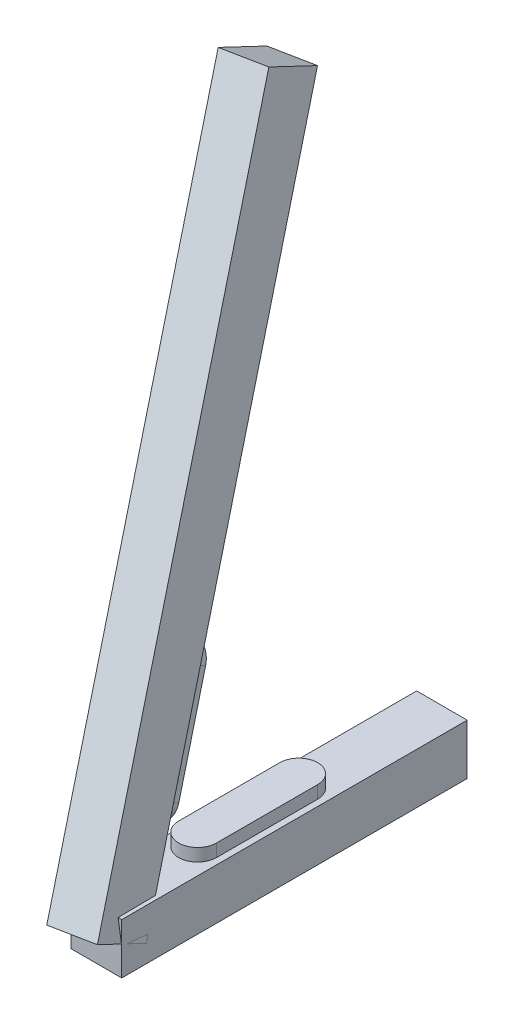
ISO-10303-21;
HEADER;
FILE_DESCRIPTION(('STEP AP214'),'2;1');
FILE_NAME('part.step','',(''),(''),'','','');
FILE_SCHEMA(('AUTOMOTIVE_DESIGN { 1 0 10303 214 1 1 1 1 }'));
ENDSEC;
DATA;
#1=APPLICATION_CONTEXT('core data for automotive mechanical design processes');
#2=APPLICATION_PROTOCOL_DEFINITION('international standard','automotive_design',2000,#1);
#3=PRODUCT_CONTEXT('',#1,'mechanical');
#4=PRODUCT('Part','Part','',(#3));
#5=PRODUCT_RELATED_PRODUCT_CATEGORY('part','',(#4));
#6=PRODUCT_DEFINITION_FORMATION('','',#4);
#7=PRODUCT_DEFINITION_CONTEXT('part definition',#1,'design');
#8=PRODUCT_DEFINITION('design','',#6,#7);
#9=PRODUCT_DEFINITION_SHAPE('','',#8);
#10=(LENGTH_UNIT() NAMED_UNIT(*) SI_UNIT(.MILLI.,.METRE.));
#11=(NAMED_UNIT(*) PLANE_ANGLE_UNIT() SI_UNIT($,.RADIAN.));
#12=(NAMED_UNIT(*) SI_UNIT($,.STERADIAN.) SOLID_ANGLE_UNIT());
#13=UNCERTAINTY_MEASURE_WITH_UNIT(LENGTH_MEASURE(1.E-05),#10,'distance_accuracy_value','');
#14=(GEOMETRIC_REPRESENTATION_CONTEXT(3) GLOBAL_UNCERTAINTY_ASSIGNED_CONTEXT((#13)) GLOBAL_UNIT_ASSIGNED_CONTEXT((#10,
#11,#12)) REPRESENTATION_CONTEXT('',''));
#15=CARTESIAN_POINT('',(0.,0.,0.));
#16=DIRECTION('',(0.,0.,1.));
#17=DIRECTION('',(1.,0.,0.));
#18=AXIS2_PLACEMENT_3D('',#15,#16,#17);
#19=CARTESIAN_POINT('',(0.,19.05,-101.6));
#20=DIRECTION('',(0.,-1.,0.));
#21=DIRECTION('',(0.,0.,-1.));
#22=AXIS2_PLACEMENT_3D('',#19,#20,#21);
#23=CYLINDRICAL_SURFACE('',#22,9.525);
#24=CARTESIAN_POINT('',(0.,12.7,-101.6));
#25=DIRECTION('',(0.,-1.,0.));
#26=DIRECTION('',(0.,0.,-1.));
#27=AXIS2_PLACEMENT_3D('',#24,#25,#26);
#28=CIRCLE('',#27,9.525);
#29=CARTESIAN_POINT('',(-9.52499999999999,12.7,-101.6));
#30=VERTEX_POINT('',#29);
#31=CARTESIAN_POINT('',(9.525,12.7,-101.599999999998));
#32=VERTEX_POINT('',#31);
#33=EDGE_CURVE('E120',#30,#32,#28,.T.);
#34=ORIENTED_EDGE('',*,*,#33,.F.);
#35=DIRECTION('',(0.,-1.,0.));
#36=VECTOR('',#35,1.);
#37=CARTESIAN_POINT('',(-9.52499999999999,19.05,-101.6));
#38=LINE('',#37,#36);
#39=CARTESIAN_POINT('',(-9.52499999999999,19.05,-101.6));
#40=VERTEX_POINT('',#39);
#41=EDGE_CURVE('E12',#40,#30,#38,.T.);
#42=ORIENTED_EDGE('',*,*,#41,.F.);
#43=CARTESIAN_POINT('',(0.,19.05,-101.6));
#44=DIRECTION('',(0.,-1.,0.));
#45=DIRECTION('',(0.,0.,-1.));
#46=AXIS2_PLACEMENT_3D('',#43,#44,#45);
#47=CIRCLE('',#46,9.525);
#48=CARTESIAN_POINT('',(9.525,19.05,-101.599999999998));
#49=VERTEX_POINT('',#48);
#50=EDGE_CURVE('E114',#40,#49,#47,.T.);
#51=ORIENTED_EDGE('',*,*,#50,.T.);
#52=DIRECTION('',(0.,-1.,0.));
#53=VECTOR('',#52,1.);
#54=CARTESIAN_POINT('',(9.525,19.05,-101.599999999998));
#55=LINE('',#54,#53);
#56=EDGE_CURVE('E59',#49,#32,#55,.T.);
#57=ORIENTED_EDGE('',*,*,#56,.T.);
#58=EDGE_LOOP('',(#34,#42,#51,#57));
#59=FACE_BOUND('',#58,.T.);
#60=ADVANCED_FACE('F56',(#59),#23,.T.);
#61=CARTESIAN_POINT('',(-9.52499999999999,19.05,-101.6));
#62=DIRECTION('',(-1.,0.,0.));
#63=DIRECTION('',(0.,0.,1.));
#64=AXIS2_PLACEMENT_3D('',#61,#62,#63);
#65=PLANE('',#64);
#66=DIRECTION('',(0.,0.,-1.));
#67=VECTOR('',#66,1.);
#68=CARTESIAN_POINT('',(-9.52499999999999,12.7,-101.6));
#69=LINE('',#68,#67);
#70=CARTESIAN_POINT('',(-9.52499999999999,12.7,-50.8));
#71=VERTEX_POINT('',#70);
#72=EDGE_CURVE('E116',#71,#30,#69,.T.);
#73=ORIENTED_EDGE('',*,*,#72,.F.);
#74=DIRECTION('',(0.,-1.,0.));
#75=VECTOR('',#74,1.);
#76=CARTESIAN_POINT('',(-9.52499999999999,19.05,-50.8));
#77=LINE('',#76,#75);
#78=CARTESIAN_POINT('',(-9.52499999999999,19.05,-50.8));
#79=VERTEX_POINT('',#78);
#80=EDGE_CURVE('E65',#79,#71,#77,.T.);
#81=ORIENTED_EDGE('',*,*,#80,.F.);
#82=DIRECTION('',(0.,0.,-1.));
#83=VECTOR('',#82,1.);
#84=CARTESIAN_POINT('',(-9.52499999999999,19.05,-101.6));
#85=LINE('',#84,#83);
#86=EDGE_CURVE('E111',#79,#40,#85,.T.);
#87=ORIENTED_EDGE('',*,*,#86,.T.);
#88=ORIENTED_EDGE('',*,*,#41,.T.);
#89=EDGE_LOOP('',(#73,#81,#87,#88));
#90=FACE_BOUND('',#89,.T.);
#91=ADVANCED_FACE('F130',(#90),#65,.T.);
#92=CARTESIAN_POINT('',(0.,19.05,-50.8));
#93=DIRECTION('',(0.,-1.,0.));
#94=DIRECTION('',(0.,0.,-1.));
#95=AXIS2_PLACEMENT_3D('',#92,#93,#94);
#96=CYLINDRICAL_SURFACE('',#95,9.525);
#97=CARTESIAN_POINT('',(0.,12.7,-50.8));
#98=DIRECTION('',(0.,-1.,0.));
#99=DIRECTION('',(0.,0.,-1.));
#100=AXIS2_PLACEMENT_3D('',#97,#98,#99);
#101=CIRCLE('',#100,9.525);
#102=CARTESIAN_POINT('',(9.525,12.7,-50.8));
#103=VERTEX_POINT('',#102);
#104=EDGE_CURVE('E106',#103,#71,#101,.T.);
#105=ORIENTED_EDGE('',*,*,#104,.F.);
#106=DIRECTION('',(0.,-1.,0.));
#107=VECTOR('',#106,1.);
#108=CARTESIAN_POINT('',(9.525,19.05,-50.8));
#109=LINE('',#108,#107);
#110=CARTESIAN_POINT('',(9.525,19.05,-50.8));
#111=VERTEX_POINT('',#110);
#112=EDGE_CURVE('E101',#111,#103,#109,.T.);
#113=ORIENTED_EDGE('',*,*,#112,.F.);
#114=CARTESIAN_POINT('',(0.,19.05,-50.8));
#115=DIRECTION('',(0.,-1.,0.));
#116=DIRECTION('',(0.,0.,-1.));
#117=AXIS2_PLACEMENT_3D('',#114,#115,#116);
#118=CIRCLE('',#117,9.525);
#119=EDGE_CURVE('E104',#111,#79,#118,.T.);
#120=ORIENTED_EDGE('',*,*,#119,.T.);
#121=ORIENTED_EDGE('',*,*,#80,.T.);
#122=EDGE_LOOP('',(#105,#113,#120,#121));
#123=FACE_BOUND('',#122,.T.);
#124=ADVANCED_FACE('F103',(#123),#96,.T.);
#125=CARTESIAN_POINT('',(9.525,19.05,-101.599999999998));
#126=DIRECTION('',(1.,0.,0.));
#127=DIRECTION('',(0.,0.,-1.));
#128=AXIS2_PLACEMENT_3D('',#125,#126,#127);
#129=PLANE('',#128);
#130=DIRECTION('',(0.,0.,1.));
#131=VECTOR('',#130,1.);
#132=CARTESIAN_POINT('',(9.525,12.7,-101.599999999998));
#133=LINE('',#132,#131);
#134=EDGE_CURVE('E123',#32,#103,#133,.T.);
#135=ORIENTED_EDGE('',*,*,#134,.F.);
#136=ORIENTED_EDGE('',*,*,#56,.F.);
#137=DIRECTION('',(0.,0.,1.));
#138=VECTOR('',#137,1.);
#139=CARTESIAN_POINT('',(9.525,19.05,-101.599999999998));
#140=LINE('',#139,#138);
#141=EDGE_CURVE('E110',#49,#111,#140,.T.);
#142=ORIENTED_EDGE('',*,*,#141,.T.);
#143=ORIENTED_EDGE('',*,*,#112,.T.);
#144=EDGE_LOOP('',(#135,#136,#142,#143));
#145=FACE_BOUND('',#144,.T.);
#146=ADVANCED_FACE('F113',(#145),#129,.T.);
#147=CARTESIAN_POINT('',(0.,19.05,-101.6));
#148=DIRECTION('',(0.,-1.,0.));
#149=DIRECTION('',(0.,0.,-1.));
#150=AXIS2_PLACEMENT_3D('',#147,#148,#149);
#151=PLANE('',#150);
#152=ORIENTED_EDGE('',*,*,#50,.F.);
#153=ORIENTED_EDGE('',*,*,#86,.F.);
#154=ORIENTED_EDGE('',*,*,#119,.F.);
#155=ORIENTED_EDGE('',*,*,#141,.F.);
#156=EDGE_LOOP('',(#152,#153,#154,#155));
#157=FACE_BOUND('',#156,.T.);
#158=ADVANCED_FACE('F109',(#157),#151,.F.);
#159=CARTESIAN_POINT('',(0.,12.7,-101.6));
#160=DIRECTION('',(0.,-1.,0.));
#161=DIRECTION('',(0.,0.,-1.));
#162=AXIS2_PLACEMENT_3D('',#159,#160,#161);
#163=PLANE('',#162);
#164=ORIENTED_EDGE('',*,*,#33,.T.);
#165=ORIENTED_EDGE('',*,*,#134,.T.);
#166=ORIENTED_EDGE('',*,*,#104,.T.);
#167=ORIENTED_EDGE('',*,*,#72,.T.);
#168=EDGE_LOOP('',(#164,#165,#166,#167));
#169=FACE_BOUND('',#168,.T.);
#170=ADVANCED_FACE('F129',(#169),#163,.T.);
#171=CLOSED_SHELL('',(#60,#91,#124,#146,#158,#170));
#172=MANIFOLD_SOLID_BREP('B2',#171);
#173=CARTESIAN_POINT('',(-13.6920913841286,83.7622771987389,-59.007372861451));
#174=DIRECTION('',(-0.0502228962965226,0.406896080641067,0.912092780503457));
#175=DIRECTION('',(0.,-0.913245264918281,0.407410218458421));
#176=AXIS2_PLACEMENT_3D('',#173,#174,#175);
#177=CYLINDRICAL_SURFACE('',#176,9.525);
#178=CARTESIAN_POINT('',(-14.0110067756115,86.3460673108096,-53.2155837052541));
#179=DIRECTION('',(-0.0502228962965226,0.406896080641067,0.912092780503457));
#180=DIRECTION('',(0.,-0.913245264918281,0.407410218458421));
#181=AXIS2_PLACEMENT_3D('',#178,#179,#180);
#182=CIRCLE('',#181,9.525);
#183=CARTESIAN_POINT('',(-4.59767830144747,87.7946903298167,-53.3435031576292));
#184=VERTEX_POINT('',#183);
#185=CARTESIAN_POINT('',(-23.4243352497755,84.8974442918027,-53.0876642528789));
#186=VERTEX_POINT('',#185);
#187=EDGE_CURVE('E254',#184,#186,#182,.T.);
#188=ORIENTED_EDGE('',*,*,#187,.F.);
#189=DIRECTION('',(-0.0502228962965226,0.406896080641067,0.912092780503457));
#190=VECTOR('',#189,1.);
#191=CARTESIAN_POINT('',(-4.27876290996455,85.2109002177459,-59.1352923138262));
#192=LINE('',#191,#190);
#193=CARTESIAN_POINT('',(-4.27876290996455,85.2109002177459,-59.1352923138262));
#194=VERTEX_POINT('',#193);
#195=EDGE_CURVE('E54',#194,#184,#192,.T.);
#196=ORIENTED_EDGE('',*,*,#195,.F.);
#197=CARTESIAN_POINT('',(-13.6920913841286,83.7622771987389,-59.007372861451));
#198=DIRECTION('',(-0.0502228962965226,0.406896080641067,0.912092780503457));
#199=DIRECTION('',(0.,-0.913245264918281,0.407410218458421));
#200=AXIS2_PLACEMENT_3D('',#197,#198,#199);
#201=CIRCLE('',#200,9.525);
#202=CARTESIAN_POINT('',(-23.1054198582926,82.3136541797319,-58.8794534090759));
#203=VERTEX_POINT('',#202);
#204=EDGE_CURVE('E248',#194,#203,#201,.T.);
#205=ORIENTED_EDGE('',*,*,#204,.T.);
#206=DIRECTION('',(-0.0502228962965226,0.406896080641067,0.912092780503457));
#207=VECTOR('',#206,1.);
#208=CARTESIAN_POINT('',(-23.1054198582926,82.3136541797319,-58.8794534090759));
#209=LINE('',#208,#207);
#210=EDGE_CURVE('E193',#203,#186,#209,.T.);
#211=ORIENTED_EDGE('',*,*,#210,.T.);
#212=EDGE_LOOP('',(#188,#196,#205,#211));
#213=FACE_BOUND('',#212,.T.);
#214=ADVANCED_FACE('F190',(#213),#177,.T.);
#215=CARTESIAN_POINT('',(-4.27876290996455,85.2109002177459,-59.1352923138262));
#216=DIRECTION('',(0.98827595529281,0.152086406194962,-0.0134298637664212));
#217=DIRECTION('',(-0.152100123296979,0.988365090689186,0.));
#218=AXIS2_PLACEMENT_3D('',#215,#216,#217);
#219=PLANE('',#218);
#220=DIRECTION('',(-0.144181472033241,0.900724877312511,-0.409763832606891));
#221=VECTOR('',#220,1.);
#222=CARTESIAN_POINT('',(-4.59767830144747,87.7946903298167,-53.3435031576292));
#223=LINE('',#222,#221);
#224=CARTESIAN_POINT('',(2.7267404778412,42.0378665623411,-32.5275004611991));
#225=VERTEX_POINT('',#224);
#226=EDGE_CURVE('E250',#225,#184,#223,.T.);
#227=ORIENTED_EDGE('',*,*,#226,.F.);
#228=DIRECTION('',(-0.0502228962965226,0.406896080641067,0.912092780503457));
#229=VECTOR('',#228,1.);
#230=CARTESIAN_POINT('',(3.04565586932411,39.4540764502703,-38.3192896173961));
#231=LINE('',#230,#229);
#232=CARTESIAN_POINT('',(3.04565586932411,39.4540764502703,-38.3192896173961));
#233=VERTEX_POINT('',#232);
#234=EDGE_CURVE('E199',#233,#225,#231,.T.);
#235=ORIENTED_EDGE('',*,*,#234,.F.);
#236=DIRECTION('',(-0.144181472033241,0.900724877312511,-0.409763832606891));
#237=VECTOR('',#236,1.);
#238=CARTESIAN_POINT('',(-4.27876290996455,85.2109002177459,-59.1352923138262));
#239=LINE('',#238,#237);
#240=EDGE_CURVE('E245',#233,#194,#239,.T.);
#241=ORIENTED_EDGE('',*,*,#240,.T.);
#242=ORIENTED_EDGE('',*,*,#195,.T.);
#243=EDGE_LOOP('',(#227,#235,#241,#242));
#244=FACE_BOUND('',#243,.T.);
#245=ADVANCED_FACE('F264',(#244),#219,.T.);
#246=CARTESIAN_POINT('',(-6.3676726048399,38.0054534312633,-38.1913701650209));
#247=DIRECTION('',(-0.0502228962965226,0.406896080641067,0.912092780503457));
#248=DIRECTION('',(0.,-0.913245264918281,0.407410218458421));
#249=AXIS2_PLACEMENT_3D('',#246,#247,#248);
#250=CYLINDRICAL_SURFACE('',#249,9.525);
#251=CARTESIAN_POINT('',(-6.68658799632282,40.589243543334,-32.399581008824));
#252=DIRECTION('',(-0.0502228962965226,0.406896080641067,0.912092780503457));
#253=DIRECTION('',(0.,-0.913245264918281,0.407410218458421));
#254=AXIS2_PLACEMENT_3D('',#251,#252,#253);
#255=CIRCLE('',#254,9.525);
#256=CARTESIAN_POINT('',(-16.0999164704868,39.140620524327,-32.2716615564488));
#257=VERTEX_POINT('',#256);
#258=EDGE_CURVE('E240',#257,#225,#255,.T.);
#259=ORIENTED_EDGE('',*,*,#258,.F.);
#260=DIRECTION('',(-0.0502228962965226,0.406896080641067,0.912092780503457));
#261=VECTOR('',#260,1.);
#262=CARTESIAN_POINT('',(-15.7810010790039,36.5568304122563,-38.0634507126458));
#263=LINE('',#262,#261);
#264=CARTESIAN_POINT('',(-15.7810010790039,36.5568304122563,-38.0634507126458));
#265=VERTEX_POINT('',#264);
#266=EDGE_CURVE('E235',#265,#257,#263,.T.);
#267=ORIENTED_EDGE('',*,*,#266,.F.);
#268=CARTESIAN_POINT('',(-6.3676726048399,38.0054534312633,-38.1913701650209));
#269=DIRECTION('',(-0.0502228962965226,0.406896080641067,0.912092780503457));
#270=DIRECTION('',(0.,-0.913245264918281,0.407410218458421));
#271=AXIS2_PLACEMENT_3D('',#268,#269,#270);
#272=CIRCLE('',#271,9.525);
#273=EDGE_CURVE('E238',#265,#233,#272,.T.);
#274=ORIENTED_EDGE('',*,*,#273,.T.);
#275=ORIENTED_EDGE('',*,*,#234,.T.);
#276=EDGE_LOOP('',(#259,#267,#274,#275));
#277=FACE_BOUND('',#276,.T.);
#278=ADVANCED_FACE('F237',(#277),#250,.T.);
#279=CARTESIAN_POINT('',(-23.1054198582926,82.3136541797319,-58.8794534090759));
#280=DIRECTION('',(-0.98827595529281,-0.152086406194962,0.0134298637664212));
#281=DIRECTION('',(0.152100123296979,-0.988365090689186,0.));
#282=AXIS2_PLACEMENT_3D('',#279,#280,#281);
#283=PLANE('',#282);
#284=DIRECTION('',(0.144181472033241,-0.900724877312512,0.409763832606891));
#285=VECTOR('',#284,1.);
#286=CARTESIAN_POINT('',(-23.4243352497755,84.8974442918027,-53.0876642528789));
#287=LINE('',#286,#285);
#288=EDGE_CURVE('E257',#186,#257,#287,.T.);
#289=ORIENTED_EDGE('',*,*,#288,.F.);
#290=ORIENTED_EDGE('',*,*,#210,.F.);
#291=DIRECTION('',(0.144181472033241,-0.900724877312512,0.409763832606891));
#292=VECTOR('',#291,1.);
#293=CARTESIAN_POINT('',(-23.1054198582926,82.3136541797319,-58.8794534090759));
#294=LINE('',#293,#292);
#295=EDGE_CURVE('E244',#203,#265,#294,.T.);
#296=ORIENTED_EDGE('',*,*,#295,.T.);
#297=ORIENTED_EDGE('',*,*,#266,.T.);
#298=EDGE_LOOP('',(#289,#290,#296,#297));
#299=FACE_BOUND('',#298,.T.);
#300=ADVANCED_FACE('F247',(#299),#283,.T.);
#301=CARTESIAN_POINT('',(-13.6920913841286,83.7622771987389,-59.007372861451));
#302=DIRECTION('',(-0.0502228962965226,0.406896080641067,0.912092780503457));
#303=DIRECTION('',(0.,-0.913245264918281,0.407410218458421));
#304=AXIS2_PLACEMENT_3D('',#301,#302,#303);
#305=PLANE('',#304);
#306=ORIENTED_EDGE('',*,*,#204,.F.);
#307=ORIENTED_EDGE('',*,*,#240,.F.);
#308=ORIENTED_EDGE('',*,*,#273,.F.);
#309=ORIENTED_EDGE('',*,*,#295,.F.);
#310=EDGE_LOOP('',(#306,#307,#308,#309));
#311=FACE_BOUND('',#310,.T.);
#312=ADVANCED_FACE('F243',(#311),#305,.F.);
#313=CARTESIAN_POINT('',(-14.0110067756115,86.3460673108096,-53.2155837052541));
#314=DIRECTION('',(-0.0502228962965226,0.406896080641067,0.912092780503457));
#315=DIRECTION('',(0.,-0.913245264918281,0.407410218458421));
#316=AXIS2_PLACEMENT_3D('',#313,#314,#315);
#317=PLANE('',#316);
#318=ORIENTED_EDGE('',*,*,#187,.T.);
#319=ORIENTED_EDGE('',*,*,#288,.T.);
#320=ORIENTED_EDGE('',*,*,#258,.T.);
#321=ORIENTED_EDGE('',*,*,#226,.T.);
#322=EDGE_LOOP('',(#318,#319,#320,#321));
#323=FACE_BOUND('',#322,.T.);
#324=ADVANCED_FACE('F263',(#323),#317,.T.);
#325=CLOSED_SHELL('',(#214,#245,#278,#300,#312,#324));
#326=MANIFOLD_SOLID_BREP('B6',#325);
#327=CARTESIAN_POINT('',(-59.9250136442468,295.203890762692,-121.069825622567));
#328=DIRECTION('',(0.98827595529281,0.15208640619496,-0.0134298637664199));
#329=DIRECTION('',(-0.152100123296977,0.988365090689187,0.));
#330=AXIS2_PLACEMENT_3D('',#327,#328,#329);
#331=PLANE('',#330);
#332=DIRECTION('',(-0.0502228962965231,0.406896080641067,0.912092780503457));
#333=VECTOR('',#332,1.);
#334=CARTESIAN_POINT('',(-13.1889354151845,3.23608286546556,11.7541375822274));
#335=LINE('',#334,#333);
#336=CARTESIAN_POINT('',(-11.9132738492528,-7.09907758281755,-11.4130190425604));
#337=VERTEX_POINT('',#336);
#338=CARTESIAN_POINT('',(-13.1889354151845,3.23608286546556,11.7541375822274));
#339=VERTEX_POINT('',#338);
#340=EDGE_CURVE('E386',#337,#339,#335,.T.);
#341=ORIENTED_EDGE('',*,*,#340,.T.);
#342=DIRECTION('',(0.144181472033239,-0.900724877312512,0.409763832606892));
#343=VECTOR('',#342,1.);
#344=CARTESIAN_POINT('',(-59.9250136442468,295.203890762692,-121.069825622567));
#345=LINE('',#344,#343);
#346=CARTESIAN_POINT('',(-59.9250136442468,295.203890762692,-121.069825622567));
#347=VERTEX_POINT('',#346);
#348=EDGE_CURVE('E188',#347,#339,#345,.T.);
#349=ORIENTED_EDGE('',*,*,#348,.F.);
#350=DIRECTION('',(-0.0502228962965231,0.406896080641067,0.912092780503457));
#351=VECTOR('',#350,1.);
#352=CARTESIAN_POINT('',(-59.9250136442468,295.203890762692,-121.069825622567));
#353=LINE('',#352,#351);
#354=CARTESIAN_POINT('',(-58.6493520783151,284.868730314409,-144.236982247355));
#355=VERTEX_POINT('',#354);
#356=EDGE_CURVE('E374',#355,#347,#353,.T.);
#357=ORIENTED_EDGE('',*,*,#356,.F.);
#358=DIRECTION('',(0.144181472033239,-0.900724877312512,0.409763832606892));
#359=VECTOR('',#358,1.);
#360=CARTESIAN_POINT('',(-58.6493520783151,284.868730314409,-144.236982247355));
#361=LINE('',#360,#359);
#362=EDGE_CURVE('E382',#355,#337,#361,.T.);
#363=ORIENTED_EDGE('',*,*,#362,.T.);
#364=EDGE_LOOP('',(#341,#349,#357,#363));
#365=FACE_BOUND('',#364,.T.);
#366=ADVANCED_FACE('F323',(#365),#331,.F.);
#367=CARTESIAN_POINT('',(-59.9250136442468,295.203890762692,-121.069825622567));
#368=DIRECTION('',(0.0502228962965229,-0.406896080641067,-0.912092780503457));
#369=DIRECTION('',(0.,0.913245264918281,-0.407410218458421));
#370=AXIS2_PLACEMENT_3D('',#367,#368,#369);
#371=PLANE('',#370);
#372=DIRECTION('',(0.98827595529281,0.15208640619496,-0.0134298637664201));
#373=VECTOR('',#372,1.);
#374=CARTESIAN_POINT('',(-13.1889354151845,3.23608286546556,11.7541375822274));
#375=LINE('',#374,#373);
#376=CARTESIAN_POINT('',(11.9132738492529,7.09907758281755,11.4130190425604));
#377=VERTEX_POINT('',#376);
#378=EDGE_CURVE('E378',#339,#377,#375,.T.);
#379=ORIENTED_EDGE('',*,*,#378,.T.);
#380=DIRECTION('',(0.144181472033239,-0.900724877312512,0.409763832606892));
#381=VECTOR('',#380,1.);
#382=CARTESIAN_POINT('',(-34.8228043798094,299.066885480044,-121.410944162234));
#383=LINE('',#382,#381);
#384=CARTESIAN_POINT('',(-34.8228043798094,299.066885480044,-121.410944162234));
#385=VERTEX_POINT('',#384);
#386=EDGE_CURVE('E331',#385,#377,#383,.T.);
#387=ORIENTED_EDGE('',*,*,#386,.F.);
#388=DIRECTION('',(0.98827595529281,0.15208640619496,-0.0134298637664201));
#389=VECTOR('',#388,1.);
#390=CARTESIAN_POINT('',(-59.9250136442468,295.203890762692,-121.069825622567));
#391=LINE('',#390,#389);
#392=EDGE_CURVE('E369',#347,#385,#391,.T.);
#393=ORIENTED_EDGE('',*,*,#392,.F.);
#394=ORIENTED_EDGE('',*,*,#348,.T.);
#395=EDGE_LOOP('',(#379,#387,#393,#394));
#396=FACE_BOUND('',#395,.T.);
#397=ADVANCED_FACE('F377',(#396),#371,.F.);
#398=CARTESIAN_POINT('',(-34.8228043798094,299.066885480044,-121.410944162234));
#399=DIRECTION('',(-0.98827595529281,-0.15208640619496,0.0134298637664201));
#400=DIRECTION('',(0.152100123296977,-0.988365090689187,0.));
#401=AXIS2_PLACEMENT_3D('',#398,#399,#400);
#402=PLANE('',#401);
#403=DIRECTION('',(0.0502228962965229,-0.406896080641067,-0.912092780503457));
#404=VECTOR('',#403,1.);
#405=CARTESIAN_POINT('',(11.9132738492529,7.09907758281755,11.4130190425604));
#406=LINE('',#405,#404);
#407=CARTESIAN_POINT('',(13.1889354151845,-3.23608286546556,-11.7541375822274));
#408=VERTEX_POINT('',#407);
#409=EDGE_CURVE('E356',#377,#408,#406,.T.);
#410=ORIENTED_EDGE('',*,*,#409,.T.);
#411=DIRECTION('',(0.144181472033239,-0.900724877312512,0.409763832606892));
#412=VECTOR('',#411,1.);
#413=CARTESIAN_POINT('',(-33.5471428138777,288.731725031761,-144.578100787022));
#414=LINE('',#413,#412);
#415=CARTESIAN_POINT('',(-33.5471428138777,288.731725031761,-144.578100787022));
#416=VERTEX_POINT('',#415);
#417=EDGE_CURVE('E379',#416,#408,#414,.T.);
#418=ORIENTED_EDGE('',*,*,#417,.F.);
#419=DIRECTION('',(0.0502228962965229,-0.406896080641067,-0.912092780503457));
#420=VECTOR('',#419,1.);
#421=CARTESIAN_POINT('',(-34.8228043798094,299.066885480044,-121.410944162234));
#422=LINE('',#421,#420);
#423=EDGE_CURVE('E372',#385,#416,#422,.T.);
#424=ORIENTED_EDGE('',*,*,#423,.F.);
#425=ORIENTED_EDGE('',*,*,#386,.T.);
#426=EDGE_LOOP('',(#410,#418,#424,#425));
#427=FACE_BOUND('',#426,.T.);
#428=ADVANCED_FACE('F380',(#427),#402,.F.);
#429=CARTESIAN_POINT('',(-58.6493520783151,284.868730314409,-144.236982247355));
#430=DIRECTION('',(-0.0502228962965228,0.406896080641067,0.912092780503457));
#431=DIRECTION('',(0.,-0.913245264918281,0.407410218458421));
#432=AXIS2_PLACEMENT_3D('',#429,#430,#431);
#433=PLANE('',#432);
#434=DIRECTION('',(-0.988275955292811,-0.15208640619496,0.0134298637664202));
#435=VECTOR('',#434,1.);
#436=CARTESIAN_POINT('',(-11.9132738492528,-7.09907758281755,-11.4130190425604));
#437=LINE('',#436,#435);
#438=EDGE_CURVE('E362',#408,#337,#437,.T.);
#439=ORIENTED_EDGE('',*,*,#438,.T.);
#440=ORIENTED_EDGE('',*,*,#362,.F.);
#441=DIRECTION('',(-0.988275955292811,-0.15208640619496,0.0134298637664202));
#442=VECTOR('',#441,1.);
#443=CARTESIAN_POINT('',(-58.6493520783151,284.868730314409,-144.236982247355));
#444=LINE('',#443,#442);
#445=EDGE_CURVE('E339',#416,#355,#444,.T.);
#446=ORIENTED_EDGE('',*,*,#445,.F.);
#447=ORIENTED_EDGE('',*,*,#417,.T.);
#448=EDGE_LOOP('',(#439,#440,#446,#447));
#449=FACE_BOUND('',#448,.T.);
#450=ADVANCED_FACE('F393',(#449),#433,.F.);
#451=CARTESIAN_POINT('',(-46.7360782290623,291.967807897226,-132.823963204794));
#452=DIRECTION('',(0.144181472033239,-0.900724877312512,0.409763832606892));
#453=DIRECTION('',(0.,-0.414090555704755,-0.910235690179267));
#454=AXIS2_PLACEMENT_3D('',#451,#452,#453);
#455=PLANE('',#454);
#456=ORIENTED_EDGE('',*,*,#356,.T.);
#457=ORIENTED_EDGE('',*,*,#392,.T.);
#458=ORIENTED_EDGE('',*,*,#423,.T.);
#459=ORIENTED_EDGE('',*,*,#445,.T.);
#460=EDGE_LOOP('',(#456,#457,#458,#459));
#461=FACE_BOUND('',#460,.T.);
#462=ADVANCED_FACE('F370',(#461),#455,.F.);
#463=CARTESIAN_POINT('',(0.,0.,0.));
#464=DIRECTION('',(0.144181472033239,-0.900724877312512,0.409763832606892));
#465=DIRECTION('',(0.,-0.414090555704755,-0.910235690179267));
#466=AXIS2_PLACEMENT_3D('',#463,#464,#465);
#467=PLANE('',#466);
#468=ORIENTED_EDGE('',*,*,#340,.F.);
#469=ORIENTED_EDGE('',*,*,#438,.F.);
#470=ORIENTED_EDGE('',*,*,#409,.F.);
#471=ORIENTED_EDGE('',*,*,#378,.F.);
#472=EDGE_LOOP('',(#468,#469,#470,#471));
#473=FACE_BOUND('',#472,.T.);
#474=ADVANCED_FACE('F396',(#473),#467,.T.);
#475=CLOSED_SHELL('',(#366,#397,#428,#450,#462,#474));
#476=MANIFOLD_SOLID_BREP('B48',#475);
#477=CARTESIAN_POINT('',(-12.7,-12.7,-173.513483966701));
#478=DIRECTION('',(-1.,0.,0.));
#479=DIRECTION('',(0.,-1.,0.));
#480=AXIS2_PLACEMENT_3D('',#477,#478,#479);
#481=PLANE('',#480);
#482=DIRECTION('',(0.,-1.,0.));
#483=VECTOR('',#482,1.);
#484=CARTESIAN_POINT('',(-12.7,-12.7,0.));
#485=LINE('',#484,#483);
#486=CARTESIAN_POINT('',(-12.7,12.7,0.));
#487=VERTEX_POINT('',#486);
#488=CARTESIAN_POINT('',(-12.7,-12.7,0.));
#489=VERTEX_POINT('',#488);
#490=EDGE_CURVE('E533',#487,#489,#485,.T.);
#491=ORIENTED_EDGE('',*,*,#490,.F.);
#492=DIRECTION('',(0.,0.,1.));
#493=VECTOR('',#492,1.);
#494=CARTESIAN_POINT('',(-12.7,12.7,-173.513483966701));
#495=LINE('',#494,#493);
#496=CARTESIAN_POINT('',(-12.7,12.7,-173.513483966701));
#497=VERTEX_POINT('',#496);
#498=EDGE_CURVE('E321',#497,#487,#495,.T.);
#499=ORIENTED_EDGE('',*,*,#498,.F.);
#500=DIRECTION('',(0.,-1.,0.));
#501=VECTOR('',#500,1.);
#502=CARTESIAN_POINT('',(-12.7,-12.7,-173.513483966701));
#503=LINE('',#502,#501);
#504=CARTESIAN_POINT('',(-12.7,-12.7,-173.513483966701));
#505=VERTEX_POINT('',#504);
#506=EDGE_CURVE('E527',#497,#505,#503,.T.);
#507=ORIENTED_EDGE('',*,*,#506,.T.);
#508=DIRECTION('',(0.,0.,1.));
#509=VECTOR('',#508,1.);
#510=CARTESIAN_POINT('',(-12.7,-12.7,-173.513483966701));
#511=LINE('',#510,#509);
#512=EDGE_CURVE('E472',#505,#489,#511,.T.);
#513=ORIENTED_EDGE('',*,*,#512,.T.);
#514=EDGE_LOOP('',(#491,#499,#507,#513));
#515=FACE_BOUND('',#514,.T.);
#516=ADVANCED_FACE('F469',(#515),#481,.T.);
#517=CARTESIAN_POINT('',(-12.7,12.7,-173.513483966701));
#518=DIRECTION('',(0.,1.,0.));
#519=DIRECTION('',(0.,0.,1.));
#520=AXIS2_PLACEMENT_3D('',#517,#518,#519);
#521=PLANE('',#520);
#522=DIRECTION('',(-1.,0.,0.));
#523=VECTOR('',#522,1.);
#524=CARTESIAN_POINT('',(-12.7,12.7,0.));
#525=LINE('',#524,#523);
#526=CARTESIAN_POINT('',(12.7,12.7,0.));
#527=VERTEX_POINT('',#526);
#528=EDGE_CURVE('E529',#527,#487,#525,.T.);
#529=ORIENTED_EDGE('',*,*,#528,.F.);
#530=DIRECTION('',(0.,0.,1.));
#531=VECTOR('',#530,1.);
#532=CARTESIAN_POINT('',(12.7,12.7,-173.513483966701));
#533=LINE('',#532,#531);
#534=CARTESIAN_POINT('',(12.7,12.7,-173.513483966701));
#535=VERTEX_POINT('',#534);
#536=EDGE_CURVE('E478',#535,#527,#533,.T.);
#537=ORIENTED_EDGE('',*,*,#536,.F.);
#538=DIRECTION('',(-1.,0.,0.));
#539=VECTOR('',#538,1.);
#540=CARTESIAN_POINT('',(-12.7,12.7,-173.513483966701));
#541=LINE('',#540,#539);
#542=EDGE_CURVE('E524',#535,#497,#541,.T.);
#543=ORIENTED_EDGE('',*,*,#542,.T.);
#544=ORIENTED_EDGE('',*,*,#498,.T.);
#545=EDGE_LOOP('',(#529,#537,#543,#544));
#546=FACE_BOUND('',#545,.T.);
#547=ADVANCED_FACE('F543',(#546),#521,.T.);
#548=CARTESIAN_POINT('',(12.7,-12.7,-173.513483966701));
#549=DIRECTION('',(1.,0.,0.));
#550=DIRECTION('',(0.,1.,0.));
#551=AXIS2_PLACEMENT_3D('',#548,#549,#550);
#552=PLANE('',#551);
#553=DIRECTION('',(0.,1.,0.));
#554=VECTOR('',#553,1.);
#555=CARTESIAN_POINT('',(12.7,-12.7,0.));
#556=LINE('',#555,#554);
#557=CARTESIAN_POINT('',(12.7,-12.7,0.));
#558=VERTEX_POINT('',#557);
#559=EDGE_CURVE('E519',#558,#527,#556,.T.);
#560=ORIENTED_EDGE('',*,*,#559,.F.);
#561=DIRECTION('',(0.,0.,1.));
#562=VECTOR('',#561,1.);
#563=CARTESIAN_POINT('',(12.7,-12.7,-173.513483966701));
#564=LINE('',#563,#562);
#565=CARTESIAN_POINT('',(12.7,-12.7,-173.513483966701));
#566=VERTEX_POINT('',#565);
#567=EDGE_CURVE('E514',#566,#558,#564,.T.);
#568=ORIENTED_EDGE('',*,*,#567,.F.);
#569=DIRECTION('',(0.,1.,0.));
#570=VECTOR('',#569,1.);
#571=CARTESIAN_POINT('',(12.7,-12.7,-173.513483966701));
#572=LINE('',#571,#570);
#573=EDGE_CURVE('E517',#566,#535,#572,.T.);
#574=ORIENTED_EDGE('',*,*,#573,.T.);
#575=ORIENTED_EDGE('',*,*,#536,.T.);
#576=EDGE_LOOP('',(#560,#568,#574,#575));
#577=FACE_BOUND('',#576,.T.);
#578=ADVANCED_FACE('F516',(#577),#552,.T.);
#579=CARTESIAN_POINT('',(-12.7,-12.7,-173.513483966701));
#580=DIRECTION('',(0.,-1.,0.));
#581=DIRECTION('',(0.,0.,-1.));
#582=AXIS2_PLACEMENT_3D('',#579,#580,#581);
#583=PLANE('',#582);
#584=DIRECTION('',(1.,0.,0.));
#585=VECTOR('',#584,1.);
#586=CARTESIAN_POINT('',(-12.7,-12.7,0.));
#587=LINE('',#586,#585);
#588=EDGE_CURVE('E536',#489,#558,#587,.T.);
#589=ORIENTED_EDGE('',*,*,#588,.F.);
#590=ORIENTED_EDGE('',*,*,#512,.F.);
#591=DIRECTION('',(1.,0.,0.));
#592=VECTOR('',#591,1.);
#593=CARTESIAN_POINT('',(-12.7,-12.7,-173.513483966701));
#594=LINE('',#593,#592);
#595=EDGE_CURVE('E523',#505,#566,#594,.T.);
#596=ORIENTED_EDGE('',*,*,#595,.T.);
#597=ORIENTED_EDGE('',*,*,#567,.T.);
#598=EDGE_LOOP('',(#589,#590,#596,#597));
#599=FACE_BOUND('',#598,.T.);
#600=ADVANCED_FACE('F526',(#599),#583,.T.);
#601=CARTESIAN_POINT('',(0.,0.,-173.513483966701));
#602=DIRECTION('',(0.,0.,-1.));
#603=DIRECTION('',(-1.,0.,0.));
#604=AXIS2_PLACEMENT_3D('',#601,#602,#603);
#605=PLANE('',#604);
#606=ORIENTED_EDGE('',*,*,#506,.F.);
#607=ORIENTED_EDGE('',*,*,#542,.F.);
#608=ORIENTED_EDGE('',*,*,#573,.F.);
#609=ORIENTED_EDGE('',*,*,#595,.F.);
#610=EDGE_LOOP('',(#606,#607,#608,#609));
#611=FACE_BOUND('',#610,.T.);
#612=ADVANCED_FACE('F522',(#611),#605,.T.);
#613=CARTESIAN_POINT('',(0.,0.,0.));
#614=DIRECTION('',(0.,0.,-1.));
#615=DIRECTION('',(-1.,0.,0.));
#616=AXIS2_PLACEMENT_3D('',#613,#614,#615);
#617=PLANE('',#616);
#618=ORIENTED_EDGE('',*,*,#490,.T.);
#619=ORIENTED_EDGE('',*,*,#588,.T.);
#620=ORIENTED_EDGE('',*,*,#559,.T.);
#621=ORIENTED_EDGE('',*,*,#528,.T.);
#622=EDGE_LOOP('',(#618,#619,#620,#621));
#623=FACE_BOUND('',#622,.T.);
#624=ADVANCED_FACE('F542',(#623),#617,.F.);
#625=CLOSED_SHELL('',(#516,#547,#578,#600,#612,#624));
#626=MANIFOLD_SOLID_BREP('B182',#625);
#627=ADVANCED_BREP_SHAPE_REPRESENTATION('',(#18,#172,#326,#476,#626),#14);
#628=SHAPE_DEFINITION_REPRESENTATION(#9,#627);
ENDSEC;
END-ISO-10303-21;
